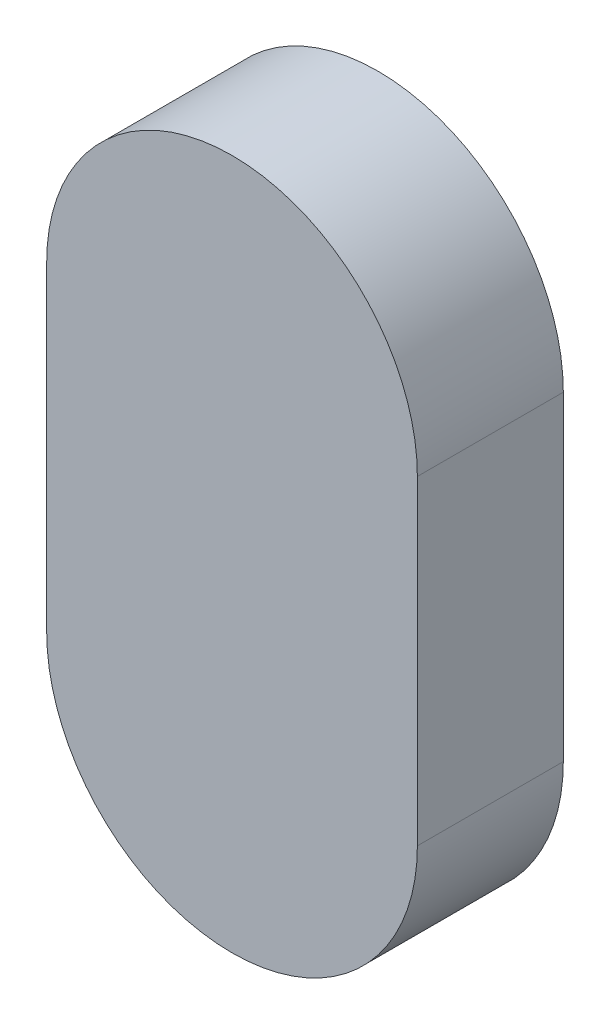
ISO-10303-21;
HEADER;
FILE_DESCRIPTION(('STEP AP214'),'2;1');
FILE_NAME('part.step','',(''),(''),'','','');
FILE_SCHEMA(('AUTOMOTIVE_DESIGN { 1 0 10303 214 1 1 1 1 }'));
ENDSEC;
DATA;
#1=APPLICATION_CONTEXT('core data for automotive mechanical design processes');
#2=APPLICATION_PROTOCOL_DEFINITION('international standard','automotive_design',2000,#1);
#3=PRODUCT_CONTEXT('',#1,'mechanical');
#4=PRODUCT('Part','Part','',(#3));
#5=PRODUCT_RELATED_PRODUCT_CATEGORY('part','',(#4));
#6=PRODUCT_DEFINITION_FORMATION('','',#4);
#7=PRODUCT_DEFINITION_CONTEXT('part definition',#1,'design');
#8=PRODUCT_DEFINITION('design','',#6,#7);
#9=PRODUCT_DEFINITION_SHAPE('','',#8);
#10=(LENGTH_UNIT() NAMED_UNIT(*) SI_UNIT(.MILLI.,.METRE.));
#11=(NAMED_UNIT(*) PLANE_ANGLE_UNIT() SI_UNIT($,.RADIAN.));
#12=(NAMED_UNIT(*) SI_UNIT($,.STERADIAN.) SOLID_ANGLE_UNIT());
#13=UNCERTAINTY_MEASURE_WITH_UNIT(LENGTH_MEASURE(1.E-05),#10,'distance_accuracy_value','');
#14=(GEOMETRIC_REPRESENTATION_CONTEXT(3) GLOBAL_UNCERTAINTY_ASSIGNED_CONTEXT((#13)) GLOBAL_UNIT_ASSIGNED_CONTEXT((#10,
#11,#12)) REPRESENTATION_CONTEXT('',''));
#15=CARTESIAN_POINT('',(0.,0.,0.));
#16=DIRECTION('',(0.,0.,1.));
#17=DIRECTION('',(1.,0.,0.));
#18=AXIS2_PLACEMENT_3D('',#15,#16,#17);
#19=CARTESIAN_POINT('',(151.830024,108.71962,0.));
#20=DIRECTION('',(-1.,0.,0.));
#21=DIRECTION('',(0.,1.,0.));
#22=AXIS2_PLACEMENT_3D('',#19,#20,#21);
#23=PLANE('',#22);
#24=DIRECTION('',(0.,1.,0.));
#25=VECTOR('',#24,1.);
#26=CARTESIAN_POINT('',(151.830024,108.71962,0.1999996));
#27=LINE('',#26,#25);
#28=CARTESIAN_POINT('',(151.830024,108.71962,0.1999996));
#29=VERTEX_POINT('',#28);
#30=CARTESIAN_POINT('',(151.830024,109.158024,0.1999996));
#31=VERTEX_POINT('',#30);
#32=EDGE_CURVE('E11',#29,#31,#27,.T.);
#33=ORIENTED_EDGE('',*,*,#32,.F.);
#34=DIRECTION('',(0.,0.,1.));
#35=VECTOR('',#34,1.);
#36=CARTESIAN_POINT('',(151.830024,108.71962,0.));
#37=LINE('',#36,#35);
#38=CARTESIAN_POINT('',(151.830024,108.71962,0.));
#39=VERTEX_POINT('',#38);
#40=EDGE_CURVE('E24',#39,#29,#37,.T.);
#41=ORIENTED_EDGE('',*,*,#40,.F.);
#42=DIRECTION('',(0.,1.,0.));
#43=VECTOR('',#42,1.);
#44=CARTESIAN_POINT('',(151.830024,108.71962,0.));
#45=LINE('',#44,#43);
#46=CARTESIAN_POINT('',(151.830024,109.158024,0.));
#47=VERTEX_POINT('',#46);
#48=EDGE_CURVE('E75',#39,#47,#45,.T.);
#49=ORIENTED_EDGE('',*,*,#48,.T.);
#50=DIRECTION('',(0.,0.,1.));
#51=VECTOR('',#50,1.);
#52=CARTESIAN_POINT('',(151.830024,109.158024,0.));
#53=LINE('',#52,#51);
#54=EDGE_CURVE('E37',#47,#31,#53,.T.);
#55=ORIENTED_EDGE('',*,*,#54,.T.);
#56=EDGE_LOOP('',(#33,#41,#49,#55));
#57=FACE_BOUND('',#56,.T.);
#58=ADVANCED_FACE('F17',(#57),#23,.F.);
#59=CARTESIAN_POINT('',(151.576024,109.158024,0.));
#60=DIRECTION('',(0.,0.,-1.));
#61=DIRECTION('',(1.,0.,0.));
#62=AXIS2_PLACEMENT_3D('',#59,#60,#61);
#63=CYLINDRICAL_SURFACE('',#62,0.254000000000005);
#64=CARTESIAN_POINT('',(151.576024,109.158024,0.1999996));
#65=DIRECTION('',(0.,0.,1.));
#66=DIRECTION('',(1.,0.,0.));
#67=AXIS2_PLACEMENT_3D('',#64,#65,#66);
#68=CIRCLE('',#67,0.254000000000005);
#69=CARTESIAN_POINT('',(151.322024,109.158024,0.1999996));
#70=VERTEX_POINT('',#69);
#71=EDGE_CURVE('E83',#31,#70,#68,.T.);
#72=ORIENTED_EDGE('',*,*,#71,.F.);
#73=ORIENTED_EDGE('',*,*,#54,.F.);
#74=CARTESIAN_POINT('',(151.576024,109.158024,0.));
#75=DIRECTION('',(0.,0.,1.));
#76=DIRECTION('',(1.,0.,0.));
#77=AXIS2_PLACEMENT_3D('',#74,#75,#76);
#78=CIRCLE('',#77,0.254000000000005);
#79=CARTESIAN_POINT('',(151.322024,109.158024,0.));
#80=VERTEX_POINT('',#79);
#81=EDGE_CURVE('E81',#47,#80,#78,.T.);
#82=ORIENTED_EDGE('',*,*,#81,.T.);
#83=DIRECTION('',(0.,0.,1.));
#84=VECTOR('',#83,1.);
#85=CARTESIAN_POINT('',(151.322024,109.158024,0.));
#86=LINE('',#85,#84);
#87=EDGE_CURVE('E67',#80,#70,#86,.T.);
#88=ORIENTED_EDGE('',*,*,#87,.T.);
#89=EDGE_LOOP('',(#72,#73,#82,#88));
#90=FACE_BOUND('',#89,.T.);
#91=ADVANCED_FACE('F89',(#90),#63,.T.);
#92=CARTESIAN_POINT('',(151.322024,109.158024,0.));
#93=DIRECTION('',(1.,0.,0.));
#94=DIRECTION('',(0.,-1.,0.));
#95=AXIS2_PLACEMENT_3D('',#92,#93,#94);
#96=PLANE('',#95);
#97=DIRECTION('',(0.,-1.,0.));
#98=VECTOR('',#97,1.);
#99=CARTESIAN_POINT('',(151.322024,109.158024,0.1999996));
#100=LINE('',#99,#98);
#101=CARTESIAN_POINT('',(151.322024,108.71962,0.1999996));
#102=VERTEX_POINT('',#101);
#103=EDGE_CURVE('E71',#70,#102,#100,.T.);
#104=ORIENTED_EDGE('',*,*,#103,.F.);
#105=ORIENTED_EDGE('',*,*,#87,.F.);
#106=DIRECTION('',(0.,-1.,0.));
#107=VECTOR('',#106,1.);
#108=CARTESIAN_POINT('',(151.322024,109.158024,0.));
#109=LINE('',#108,#107);
#110=CARTESIAN_POINT('',(151.322024,108.71962,0.));
#111=VERTEX_POINT('',#110);
#112=EDGE_CURVE('E63',#80,#111,#109,.T.);
#113=ORIENTED_EDGE('',*,*,#112,.T.);
#114=DIRECTION('',(0.,0.,1.));
#115=VECTOR('',#114,1.);
#116=CARTESIAN_POINT('',(151.322024,108.71962,0.));
#117=LINE('',#116,#115);
#118=EDGE_CURVE('E53',#111,#102,#117,.T.);
#119=ORIENTED_EDGE('',*,*,#118,.T.);
#120=EDGE_LOOP('',(#104,#105,#113,#119));
#121=FACE_BOUND('',#120,.T.);
#122=ADVANCED_FACE('F66',(#121),#96,.F.);
#123=CARTESIAN_POINT('',(151.576024,108.71962,0.));
#124=DIRECTION('',(0.,0.,-1.));
#125=DIRECTION('',(-1.,0.,0.));
#126=AXIS2_PLACEMENT_3D('',#123,#124,#125);
#127=CYLINDRICAL_SURFACE('',#126,0.254);
#128=CARTESIAN_POINT('',(151.576024,108.71962,0.1999996));
#129=DIRECTION('',(0.,0.,1.));
#130=DIRECTION('',(-1.,0.,0.));
#131=AXIS2_PLACEMENT_3D('',#128,#129,#130);
#132=CIRCLE('',#131,0.254);
#133=EDGE_CURVE('E59',#102,#29,#132,.T.);
#134=ORIENTED_EDGE('',*,*,#133,.F.);
#135=ORIENTED_EDGE('',*,*,#118,.F.);
#136=CARTESIAN_POINT('',(151.576024,108.71962,0.));
#137=DIRECTION('',(0.,0.,1.));
#138=DIRECTION('',(-1.,0.,0.));
#139=AXIS2_PLACEMENT_3D('',#136,#137,#138);
#140=CIRCLE('',#139,0.254);
#141=EDGE_CURVE('E57',#111,#39,#140,.T.);
#142=ORIENTED_EDGE('',*,*,#141,.T.);
#143=ORIENTED_EDGE('',*,*,#40,.T.);
#144=EDGE_LOOP('',(#134,#135,#142,#143));
#145=FACE_BOUND('',#144,.T.);
#146=ADVANCED_FACE('F55',(#145),#127,.T.);
#147=CARTESIAN_POINT('',(151.830024,108.71962,0.));
#148=DIRECTION('',(0.,0.,-1.));
#149=DIRECTION('',(-1.,0.,0.));
#150=AXIS2_PLACEMENT_3D('',#147,#148,#149);
#151=PLANE('',#150);
#152=ORIENTED_EDGE('',*,*,#141,.F.);
#153=ORIENTED_EDGE('',*,*,#112,.F.);
#154=ORIENTED_EDGE('',*,*,#81,.F.);
#155=ORIENTED_EDGE('',*,*,#48,.F.);
#156=EDGE_LOOP('',(#152,#153,#154,#155));
#157=FACE_BOUND('',#156,.T.);
#158=ADVANCED_FACE('F74',(#157),#151,.T.);
#159=CARTESIAN_POINT('',(151.830024,108.71962,0.1999996));
#160=DIRECTION('',(0.,0.,-1.));
#161=DIRECTION('',(-1.,0.,0.));
#162=AXIS2_PLACEMENT_3D('',#159,#160,#161);
#163=PLANE('',#162);
#164=ORIENTED_EDGE('',*,*,#32,.T.);
#165=ORIENTED_EDGE('',*,*,#71,.T.);
#166=ORIENTED_EDGE('',*,*,#103,.T.);
#167=ORIENTED_EDGE('',*,*,#133,.T.);
#168=EDGE_LOOP('',(#164,#165,#166,#167));
#169=FACE_BOUND('',#168,.T.);
#170=ADVANCED_FACE('F91',(#169),#163,.F.);
#171=CLOSED_SHELL('',(#58,#91,#122,#146,#158,#170));
#172=MANIFOLD_SOLID_BREP('B1',#171);
#173=ADVANCED_BREP_SHAPE_REPRESENTATION('',(#18,#172),#14);
#174=SHAPE_DEFINITION_REPRESENTATION(#9,#173);
ENDSEC;
END-ISO-10303-21;
